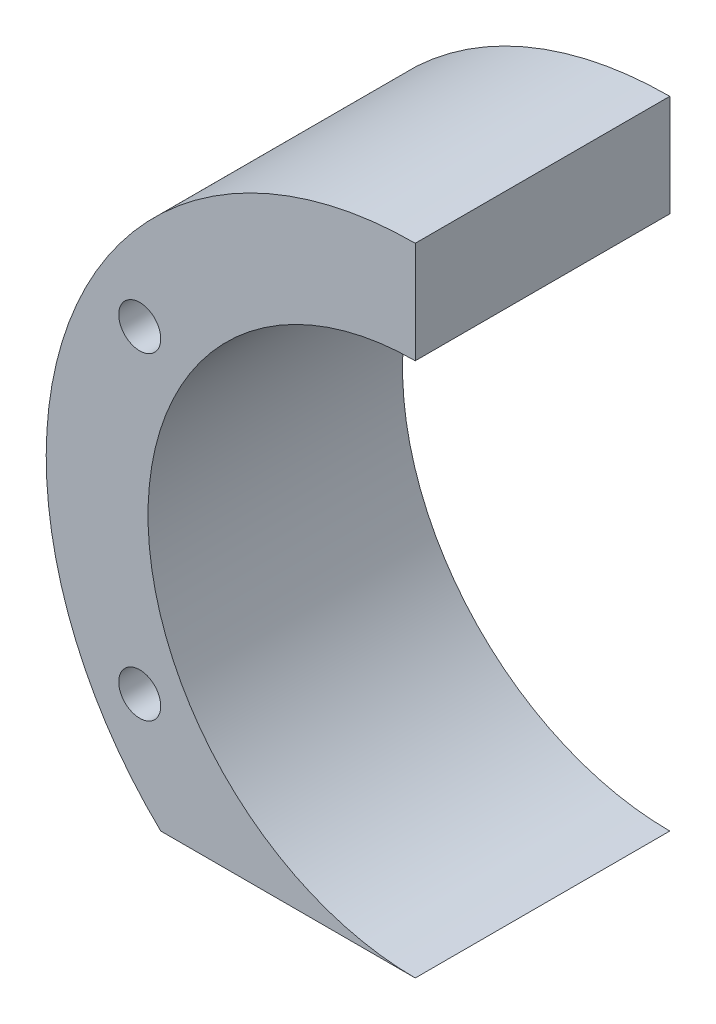
ISO-10303-21;
HEADER;
FILE_DESCRIPTION(('STEP AP214'),'2;1');
FILE_NAME('part.step','',(''),(''),'','','');
FILE_SCHEMA(('AUTOMOTIVE_DESIGN { 1 0 10303 214 1 1 1 1 }'));
ENDSEC;
DATA;
#1=APPLICATION_CONTEXT('core data for automotive mechanical design processes');
#2=APPLICATION_PROTOCOL_DEFINITION('international standard','automotive_design',2000,#1);
#3=PRODUCT_CONTEXT('',#1,'mechanical');
#4=PRODUCT('Part','Part','',(#3));
#5=PRODUCT_RELATED_PRODUCT_CATEGORY('part','',(#4));
#6=PRODUCT_DEFINITION_FORMATION('','',#4);
#7=PRODUCT_DEFINITION_CONTEXT('part definition',#1,'design');
#8=PRODUCT_DEFINITION('design','',#6,#7);
#9=PRODUCT_DEFINITION_SHAPE('','',#8);
#10=(LENGTH_UNIT() NAMED_UNIT(*) SI_UNIT(.MILLI.,.METRE.));
#11=(NAMED_UNIT(*) PLANE_ANGLE_UNIT() SI_UNIT($,.RADIAN.));
#12=(NAMED_UNIT(*) SI_UNIT($,.STERADIAN.) SOLID_ANGLE_UNIT());
#13=UNCERTAINTY_MEASURE_WITH_UNIT(LENGTH_MEASURE(1.E-05),#10,'distance_accuracy_value','');
#14=(GEOMETRIC_REPRESENTATION_CONTEXT(3) GLOBAL_UNCERTAINTY_ASSIGNED_CONTEXT((#13)) GLOBAL_UNIT_ASSIGNED_CONTEXT((#10,
#11,#12)) REPRESENTATION_CONTEXT('',''));
#15=CARTESIAN_POINT('',(0.,0.,0.));
#16=DIRECTION('',(0.,0.,1.));
#17=DIRECTION('',(1.,0.,0.));
#18=AXIS2_PLACEMENT_3D('',#15,#16,#17);
#19=CARTESIAN_POINT('',(0.,0.,20.));
#20=DIRECTION('',(0.,0.,-1.));
#21=DIRECTION('',(-1.,0.,0.));
#22=AXIS2_PLACEMENT_3D('',#19,#20,#21);
#23=CYLINDRICAL_SURFACE('',#22,29.);
#24=CARTESIAN_POINT('',(0.,0.,0.));
#25=DIRECTION('',(0.,0.,1.));
#26=DIRECTION('',(1.,0.,0.));
#27=AXIS2_PLACEMENT_3D('',#24,#25,#26);
#28=CIRCLE('',#27,29.);
#29=CARTESIAN_POINT('',(0.,29.,0.));
#30=VERTEX_POINT('',#29);
#31=CARTESIAN_POINT('',(-20.,-21.,0.));
#32=VERTEX_POINT('',#31);
#33=EDGE_CURVE('E112',#30,#32,#28,.T.);
#34=ORIENTED_EDGE('',*,*,#33,.T.);
#35=DIRECTION('',(0.,0.,-1.));
#36=VECTOR('',#35,1.);
#37=CARTESIAN_POINT('',(-20.,-21.,20.));
#38=LINE('',#37,#36);
#39=CARTESIAN_POINT('',(-20.,-21.,20.));
#40=VERTEX_POINT('',#39);
#41=EDGE_CURVE('E11',#40,#32,#38,.T.);
#42=ORIENTED_EDGE('',*,*,#41,.F.);
#43=CARTESIAN_POINT('',(0.,0.,20.));
#44=DIRECTION('',(0.,0.,1.));
#45=DIRECTION('',(1.,0.,0.));
#46=AXIS2_PLACEMENT_3D('',#43,#44,#45);
#47=CIRCLE('',#46,29.);
#48=CARTESIAN_POINT('',(0.,29.,20.));
#49=VERTEX_POINT('',#48);
#50=EDGE_CURVE('E96',#49,#40,#47,.T.);
#51=ORIENTED_EDGE('',*,*,#50,.F.);
#52=DIRECTION('',(0.,0.,-1.));
#53=VECTOR('',#52,1.);
#54=CARTESIAN_POINT('',(0.,29.,20.));
#55=LINE('',#54,#53);
#56=EDGE_CURVE('E108',#49,#30,#55,.T.);
#57=ORIENTED_EDGE('',*,*,#56,.T.);
#58=EDGE_LOOP('',(#34,#42,#51,#57));
#59=FACE_BOUND('',#58,.T.);
#60=ADVANCED_FACE('F44',(#59),#23,.T.);
#61=CARTESIAN_POINT('',(-20.,-21.,20.));
#62=DIRECTION('',(0.,1.,0.));
#63=DIRECTION('',(0.,0.,1.));
#64=AXIS2_PLACEMENT_3D('',#61,#62,#63);
#65=PLANE('',#64);
#66=DIRECTION('',(1.,0.,0.));
#67=VECTOR('',#66,1.);
#68=CARTESIAN_POINT('',(-20.,-21.,0.));
#69=LINE('',#68,#67);
#70=CARTESIAN_POINT('',(0.,-21.,0.));
#71=VERTEX_POINT('',#70);
#72=EDGE_CURVE('E101',#32,#71,#69,.T.);
#73=ORIENTED_EDGE('',*,*,#72,.T.);
#74=DIRECTION('',(0.,0.,-1.));
#75=VECTOR('',#74,1.);
#76=CARTESIAN_POINT('',(0.,-21.,20.));
#77=LINE('',#76,#75);
#78=CARTESIAN_POINT('',(0.,-21.,20.));
#79=VERTEX_POINT('',#78);
#80=EDGE_CURVE('E53',#79,#71,#77,.T.);
#81=ORIENTED_EDGE('',*,*,#80,.F.);
#82=DIRECTION('',(1.,0.,0.));
#83=VECTOR('',#82,1.);
#84=CARTESIAN_POINT('',(-20.,-21.,20.));
#85=LINE('',#84,#83);
#86=EDGE_CURVE('E91',#40,#79,#85,.T.);
#87=ORIENTED_EDGE('',*,*,#86,.F.);
#88=ORIENTED_EDGE('',*,*,#41,.T.);
#89=EDGE_LOOP('',(#73,#81,#87,#88));
#90=FACE_BOUND('',#89,.T.);
#91=ADVANCED_FACE('F100',(#90),#65,.F.);
#92=CARTESIAN_POINT('',(0.,0.,20.));
#93=DIRECTION('',(0.,0.,-1.));
#94=DIRECTION('',(-1.,0.,0.));
#95=AXIS2_PLACEMENT_3D('',#92,#93,#94);
#96=CYLINDRICAL_SURFACE('',#95,21.);
#97=CARTESIAN_POINT('',(0.,0.,0.));
#98=DIRECTION('',(0.,0.,-1.));
#99=DIRECTION('',(1.,0.,0.));
#100=AXIS2_PLACEMENT_3D('',#97,#98,#99);
#101=CIRCLE('',#100,21.);
#102=CARTESIAN_POINT('',(0.,21.,0.));
#103=VERTEX_POINT('',#102);
#104=EDGE_CURVE('E78',#71,#103,#101,.T.);
#105=ORIENTED_EDGE('',*,*,#104,.T.);
#106=DIRECTION('',(0.,0.,-1.));
#107=VECTOR('',#106,1.);
#108=CARTESIAN_POINT('',(0.,21.,20.));
#109=LINE('',#108,#107);
#110=CARTESIAN_POINT('',(0.,21.,20.));
#111=VERTEX_POINT('',#110);
#112=EDGE_CURVE('E103',#111,#103,#109,.T.);
#113=ORIENTED_EDGE('',*,*,#112,.F.);
#114=CARTESIAN_POINT('',(0.,0.,20.));
#115=DIRECTION('',(0.,0.,-1.));
#116=DIRECTION('',(1.,0.,0.));
#117=AXIS2_PLACEMENT_3D('',#114,#115,#116);
#118=CIRCLE('',#117,21.);
#119=EDGE_CURVE('E94',#79,#111,#118,.T.);
#120=ORIENTED_EDGE('',*,*,#119,.F.);
#121=ORIENTED_EDGE('',*,*,#80,.T.);
#122=EDGE_LOOP('',(#105,#113,#120,#121));
#123=FACE_BOUND('',#122,.T.);
#124=ADVANCED_FACE('F104',(#123),#96,.F.);
#125=CARTESIAN_POINT('',(0.,29.,20.));
#126=DIRECTION('',(-1.,0.,0.));
#127=DIRECTION('',(0.,-1.,0.));
#128=AXIS2_PLACEMENT_3D('',#125,#126,#127);
#129=PLANE('',#128);
#130=DIRECTION('',(0.,1.,0.));
#131=VECTOR('',#130,1.);
#132=CARTESIAN_POINT('',(0.,29.,0.));
#133=LINE('',#132,#131);
#134=EDGE_CURVE('E84',#103,#30,#133,.T.);
#135=ORIENTED_EDGE('',*,*,#134,.T.);
#136=ORIENTED_EDGE('',*,*,#56,.F.);
#137=DIRECTION('',(0.,1.,0.));
#138=VECTOR('',#137,1.);
#139=CARTESIAN_POINT('',(0.,29.,20.));
#140=LINE('',#139,#138);
#141=EDGE_CURVE('E61',#111,#49,#140,.T.);
#142=ORIENTED_EDGE('',*,*,#141,.F.);
#143=ORIENTED_EDGE('',*,*,#112,.T.);
#144=EDGE_LOOP('',(#135,#136,#142,#143));
#145=FACE_BOUND('',#144,.T.);
#146=ADVANCED_FACE('F126',(#145),#129,.F.);
#147=CARTESIAN_POINT('',(0.,0.,20.));
#148=DIRECTION('',(0.,0.,1.));
#149=DIRECTION('',(1.,0.,0.));
#150=AXIS2_PLACEMENT_3D('',#147,#148,#149);
#151=PLANE('',#150);
#152=CARTESIAN_POINT('',(-21.6506350946109,12.5000000000001,20.));
#153=DIRECTION('',(0.,0.,1.));
#154=DIRECTION('',(1.,0.,0.));
#155=AXIS2_PLACEMENT_3D('',#152,#153,#154);
#156=CIRCLE('',#155,1.65);
#157=CARTESIAN_POINT('',(-20.0006350946109,12.5000000000001,20.));
#158=VERTEX_POINT('',#157);
#159=EDGE_CURVE('E141',#158,#158,#156,.T.);
#160=ORIENTED_EDGE('',*,*,#159,.F.);
#161=EDGE_LOOP('',(#160));
#162=FACE_BOUND('',#161,.T.);
#163=CARTESIAN_POINT('',(-21.650635094611,-12.5,20.));
#164=DIRECTION('',(0.,0.,1.));
#165=DIRECTION('',(1.,0.,0.));
#166=AXIS2_PLACEMENT_3D('',#163,#164,#165);
#167=CIRCLE('',#166,1.65);
#168=CARTESIAN_POINT('',(-20.000635094611,-12.5,20.));
#169=VERTEX_POINT('',#168);
#170=EDGE_CURVE('E133',#169,#169,#167,.T.);
#171=ORIENTED_EDGE('',*,*,#170,.F.);
#172=EDGE_LOOP('',(#171));
#173=FACE_BOUND('',#172,.T.);
#174=ORIENTED_EDGE('',*,*,#50,.T.);
#175=ORIENTED_EDGE('',*,*,#86,.T.);
#176=ORIENTED_EDGE('',*,*,#119,.T.);
#177=ORIENTED_EDGE('',*,*,#141,.T.);
#178=EDGE_LOOP('',(#174,#175,#176,#177));
#179=FACE_BOUND('',#178,.T.);
#180=ADVANCED_FACE('F92',(#162,#173,#179),#151,.T.);
#181=CARTESIAN_POINT('',(0.,0.,0.));
#182=DIRECTION('',(0.,0.,1.));
#183=DIRECTION('',(1.,0.,0.));
#184=AXIS2_PLACEMENT_3D('',#181,#182,#183);
#185=PLANE('',#184);
#186=CARTESIAN_POINT('',(-21.6506350946109,12.5000000000001,0.));
#187=DIRECTION('',(0.,0.,1.));
#188=DIRECTION('',(1.,0.,0.));
#189=AXIS2_PLACEMENT_3D('',#186,#187,#188);
#190=CIRCLE('',#189,1.65);
#191=CARTESIAN_POINT('',(-20.0006350946109,12.5000000000001,0.));
#192=VERTEX_POINT('',#191);
#193=EDGE_CURVE('E116',#192,#192,#190,.T.);
#194=ORIENTED_EDGE('',*,*,#193,.T.);
#195=EDGE_LOOP('',(#194));
#196=FACE_BOUND('',#195,.T.);
#197=CARTESIAN_POINT('',(-21.650635094611,-12.5,0.));
#198=DIRECTION('',(0.,0.,1.));
#199=DIRECTION('',(1.,0.,0.));
#200=AXIS2_PLACEMENT_3D('',#197,#198,#199);
#201=CIRCLE('',#200,1.65);
#202=CARTESIAN_POINT('',(-20.000635094611,-12.5,0.));
#203=VERTEX_POINT('',#202);
#204=EDGE_CURVE('E137',#203,#203,#201,.T.);
#205=ORIENTED_EDGE('',*,*,#204,.T.);
#206=EDGE_LOOP('',(#205));
#207=FACE_BOUND('',#206,.T.);
#208=ORIENTED_EDGE('',*,*,#33,.F.);
#209=ORIENTED_EDGE('',*,*,#134,.F.);
#210=ORIENTED_EDGE('',*,*,#104,.F.);
#211=ORIENTED_EDGE('',*,*,#72,.F.);
#212=EDGE_LOOP('',(#208,#209,#210,#211));
#213=FACE_BOUND('',#212,.T.);
#214=ADVANCED_FACE('F129',(#196,#207,#213),#185,.F.);
#215=CARTESIAN_POINT('',(-21.650635094611,-12.5,20.));
#216=DIRECTION('',(0.,0.,-1.));
#217=DIRECTION('',(-1.,0.,0.));
#218=AXIS2_PLACEMENT_3D('',#215,#216,#217);
#219=CYLINDRICAL_SURFACE('',#218,1.65);
#220=ORIENTED_EDGE('',*,*,#170,.T.);
#221=EDGE_LOOP('',(#220));
#222=FACE_BOUND('',#221,.T.);
#223=ORIENTED_EDGE('',*,*,#204,.F.);
#224=EDGE_LOOP('',(#223));
#225=FACE_BOUND('',#224,.T.);
#226=ADVANCED_FACE('F153',(#222,#225),#219,.F.);
#227=CARTESIAN_POINT('',(-21.6506350946109,12.5000000000001,20.));
#228=DIRECTION('',(0.,0.,-1.));
#229=DIRECTION('',(-1.,0.,0.));
#230=AXIS2_PLACEMENT_3D('',#227,#228,#229);
#231=CYLINDRICAL_SURFACE('',#230,1.65);
#232=ORIENTED_EDGE('',*,*,#159,.T.);
#233=EDGE_LOOP('',(#232));
#234=FACE_BOUND('',#233,.T.);
#235=ORIENTED_EDGE('',*,*,#193,.F.);
#236=EDGE_LOOP('',(#235));
#237=FACE_BOUND('',#236,.T.);
#238=ADVANCED_FACE('F151',(#234,#237),#231,.F.);
#239=CLOSED_SHELL('',(#60,#91,#124,#146,#180,#214,#226,#238));
#240=MANIFOLD_SOLID_BREP('B2',#239);
#241=ADVANCED_BREP_SHAPE_REPRESENTATION('',(#18,#240),#14);
#242=SHAPE_DEFINITION_REPRESENTATION(#9,#241);
ENDSEC;
END-ISO-10303-21;
